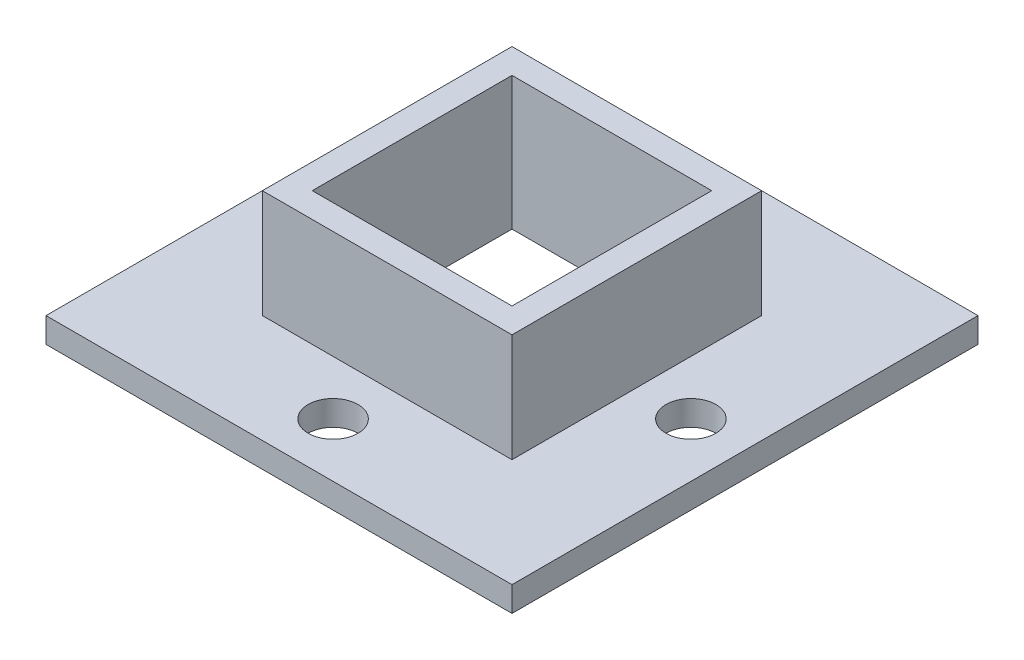
ISO-10303-21;
HEADER;
FILE_DESCRIPTION(('STEP AP214'),'2;1');
FILE_NAME('part.step','',(''),(''),'','','');
FILE_SCHEMA(('AUTOMOTIVE_DESIGN { 1 0 10303 214 1 1 1 1 }'));
ENDSEC;
DATA;
#1=APPLICATION_CONTEXT('core data for automotive mechanical design processes');
#2=APPLICATION_PROTOCOL_DEFINITION('international standard','automotive_design',2000,#1);
#3=PRODUCT_CONTEXT('',#1,'mechanical');
#4=PRODUCT('Part','Part','',(#3));
#5=PRODUCT_RELATED_PRODUCT_CATEGORY('part','',(#4));
#6=PRODUCT_DEFINITION_FORMATION('','',#4);
#7=PRODUCT_DEFINITION_CONTEXT('part definition',#1,'design');
#8=PRODUCT_DEFINITION('design','',#6,#7);
#9=PRODUCT_DEFINITION_SHAPE('','',#8);
#10=(LENGTH_UNIT() NAMED_UNIT(*) SI_UNIT(.MILLI.,.METRE.));
#11=(NAMED_UNIT(*) PLANE_ANGLE_UNIT() SI_UNIT($,.RADIAN.));
#12=(NAMED_UNIT(*) SI_UNIT($,.STERADIAN.) SOLID_ANGLE_UNIT());
#13=UNCERTAINTY_MEASURE_WITH_UNIT(LENGTH_MEASURE(1.E-05),#10,'distance_accuracy_value','');
#14=(GEOMETRIC_REPRESENTATION_CONTEXT(3) GLOBAL_UNCERTAINTY_ASSIGNED_CONTEXT((#13)) GLOBAL_UNIT_ASSIGNED_CONTEXT((#10,
#11,#12)) REPRESENTATION_CONTEXT('',''));
#15=CARTESIAN_POINT('',(0.,0.,0.));
#16=DIRECTION('',(0.,0.,1.));
#17=DIRECTION('',(1.,0.,0.));
#18=AXIS2_PLACEMENT_3D('',#15,#16,#17);
#19=CARTESIAN_POINT('',(0.,9.525,0.));
#20=DIRECTION('',(0.,-1.,0.));
#21=DIRECTION('',(0.,0.,-1.));
#22=AXIS2_PLACEMENT_3D('',#19,#20,#21);
#23=PLANE('',#22);
#24=CARTESIAN_POINT('',(0.,9.525,-68.2625));
#25=DIRECTION('',(0.,1.,0.));
#26=DIRECTION('',(0.,0.,-1.));
#27=AXIS2_PLACEMENT_3D('',#24,#25,#26);
#28=CIRCLE('',#27,9.52499999999999);
#29=CARTESIAN_POINT('',(0.,9.525,-77.7875));
#30=VERTEX_POINT('',#29);
#31=EDGE_CURVE('E232',#30,#30,#28,.T.);
#32=ORIENTED_EDGE('',*,*,#31,.F.);
#33=EDGE_LOOP('',(#32));
#34=FACE_BOUND('',#33,.T.);
#35=CARTESIAN_POINT('',(-68.2625,9.525,0.));
#36=DIRECTION('',(0.,1.,0.));
#37=DIRECTION('',(0.,0.,-1.));
#38=AXIS2_PLACEMENT_3D('',#35,#36,#37);
#39=CIRCLE('',#38,9.52500000000001);
#40=CARTESIAN_POINT('',(-68.2625,9.525,-9.525));
#41=VERTEX_POINT('',#40);
#42=EDGE_CURVE('E246',#41,#41,#39,.T.);
#43=ORIENTED_EDGE('',*,*,#42,.F.);
#44=EDGE_LOOP('',(#43));
#45=FACE_BOUND('',#44,.T.);
#46=CARTESIAN_POINT('',(68.2625,9.525,0.));
#47=DIRECTION('',(0.,1.,0.));
#48=DIRECTION('',(0.,0.,1.));
#49=AXIS2_PLACEMENT_3D('',#46,#47,#48);
#50=CIRCLE('',#49,9.525);
#51=CARTESIAN_POINT('',(68.2625,9.525,9.52500000000007));
#52=VERTEX_POINT('',#51);
#53=EDGE_CURVE('E243',#52,#52,#50,.T.);
#54=ORIENTED_EDGE('',*,*,#53,.F.);
#55=EDGE_LOOP('',(#54));
#56=FACE_BOUND('',#55,.T.);
#57=CARTESIAN_POINT('',(0.,9.525,68.2625));
#58=DIRECTION('',(0.,1.,0.));
#59=DIRECTION('',(0.,0.,1.));
#60=AXIS2_PLACEMENT_3D('',#57,#58,#59);
#61=CIRCLE('',#60,9.525);
#62=CARTESIAN_POINT('',(0.,9.525,77.7875));
#63=VERTEX_POINT('',#62);
#64=EDGE_CURVE('E228',#63,#63,#61,.T.);
#65=ORIENTED_EDGE('',*,*,#64,.F.);
#66=EDGE_LOOP('',(#65));
#67=FACE_BOUND('',#66,.T.);
#68=DIRECTION('',(0.,0.,1.));
#69=VECTOR('',#68,1.);
#70=CARTESIAN_POINT('',(-88.9,9.525,88.9));
#71=LINE('',#70,#69);
#72=CARTESIAN_POINT('',(-88.9,9.525,-88.9));
#73=VERTEX_POINT('',#72);
#74=CARTESIAN_POINT('',(-88.9,9.525,88.9));
#75=VERTEX_POINT('',#74);
#76=EDGE_CURVE('E201',#73,#75,#71,.T.);
#77=ORIENTED_EDGE('',*,*,#76,.T.);
#78=DIRECTION('',(1.,0.,0.));
#79=VECTOR('',#78,1.);
#80=CARTESIAN_POINT('',(-88.9,9.525,88.9));
#81=LINE('',#80,#79);
#82=CARTESIAN_POINT('',(88.9,9.525,88.9));
#83=VERTEX_POINT('',#82);
#84=EDGE_CURVE('E204',#75,#83,#81,.T.);
#85=ORIENTED_EDGE('',*,*,#84,.T.);
#86=DIRECTION('',(0.,0.,-1.));
#87=VECTOR('',#86,1.);
#88=CARTESIAN_POINT('',(88.9,9.525,88.9));
#89=LINE('',#88,#87);
#90=CARTESIAN_POINT('',(88.9,9.525,-88.9));
#91=VERTEX_POINT('',#90);
#92=EDGE_CURVE('E207',#83,#91,#89,.T.);
#93=ORIENTED_EDGE('',*,*,#92,.T.);
#94=DIRECTION('',(-1.,0.,0.));
#95=VECTOR('',#94,1.);
#96=CARTESIAN_POINT('',(-88.9,9.525,-88.9));
#97=LINE('',#96,#95);
#98=EDGE_CURVE('E209',#91,#73,#97,.T.);
#99=ORIENTED_EDGE('',*,*,#98,.T.);
#100=EDGE_LOOP('',(#77,#85,#93,#99));
#101=FACE_BOUND('',#100,.T.);
#102=DIRECTION('',(-1.,0.,0.));
#103=VECTOR('',#102,1.);
#104=CARTESIAN_POINT('',(-47.625,9.525,-47.625));
#105=LINE('',#104,#103);
#106=CARTESIAN_POINT('',(47.625,9.525,-47.625));
#107=VERTEX_POINT('',#106);
#108=CARTESIAN_POINT('',(-47.625,9.525,-47.625));
#109=VERTEX_POINT('',#108);
#110=EDGE_CURVE('E158',#107,#109,#105,.T.);
#111=ORIENTED_EDGE('',*,*,#110,.F.);
#112=DIRECTION('',(0.,0.,-1.));
#113=VECTOR('',#112,1.);
#114=CARTESIAN_POINT('',(47.625,9.525,-47.625));
#115=LINE('',#114,#113);
#116=CARTESIAN_POINT('',(47.625,9.525,47.625));
#117=VERTEX_POINT('',#116);
#118=EDGE_CURVE('E163',#117,#107,#115,.T.);
#119=ORIENTED_EDGE('',*,*,#118,.F.);
#120=DIRECTION('',(1.,0.,0.));
#121=VECTOR('',#120,1.);
#122=CARTESIAN_POINT('',(-47.625,9.525,47.625));
#123=LINE('',#122,#121);
#124=CARTESIAN_POINT('',(-47.625,9.525,47.625));
#125=VERTEX_POINT('',#124);
#126=EDGE_CURVE('E59',#125,#117,#123,.T.);
#127=ORIENTED_EDGE('',*,*,#126,.F.);
#128=DIRECTION('',(0.,0.,1.));
#129=VECTOR('',#128,1.);
#130=CARTESIAN_POINT('',(-47.625,9.525,-47.625));
#131=LINE('',#130,#129);
#132=EDGE_CURVE('E54',#109,#125,#131,.T.);
#133=ORIENTED_EDGE('',*,*,#132,.F.);
#134=EDGE_LOOP('',(#111,#119,#127,#133));
#135=FACE_BOUND('',#134,.T.);
#136=ADVANCED_FACE('F37',(#34,#45,#56,#67,#101,#135),#23,.F.);
#137=CARTESIAN_POINT('',(0.,0.,0.));
#138=DIRECTION('',(0.,-1.,0.));
#139=DIRECTION('',(0.,0.,-1.));
#140=AXIS2_PLACEMENT_3D('',#137,#138,#139);
#141=PLANE('',#140);
#142=CARTESIAN_POINT('',(0.,0.,-68.2625));
#143=DIRECTION('',(0.,-1.,0.));
#144=DIRECTION('',(0.,0.,-1.));
#145=AXIS2_PLACEMENT_3D('',#142,#143,#144);
#146=CIRCLE('',#145,9.52499999999999);
#147=CARTESIAN_POINT('',(0.,0.,-77.7875));
#148=VERTEX_POINT('',#147);
#149=EDGE_CURVE('E41',#148,#148,#146,.T.);
#150=ORIENTED_EDGE('',*,*,#149,.F.);
#151=EDGE_LOOP('',(#150));
#152=FACE_BOUND('',#151,.T.);
#153=CARTESIAN_POINT('',(-68.2625,0.,0.));
#154=DIRECTION('',(0.,-1.,0.));
#155=DIRECTION('',(0.,0.,-1.));
#156=AXIS2_PLACEMENT_3D('',#153,#154,#155);
#157=CIRCLE('',#156,9.52500000000001);
#158=CARTESIAN_POINT('',(-68.2625,0.,-9.525));
#159=VERTEX_POINT('',#158);
#160=EDGE_CURVE('E231',#159,#159,#157,.T.);
#161=ORIENTED_EDGE('',*,*,#160,.F.);
#162=EDGE_LOOP('',(#161));
#163=FACE_BOUND('',#162,.T.);
#164=CARTESIAN_POINT('',(68.2625,0.,0.));
#165=DIRECTION('',(0.,-1.,0.));
#166=DIRECTION('',(0.,0.,-1.));
#167=AXIS2_PLACEMENT_3D('',#164,#165,#166);
#168=CIRCLE('',#167,9.525);
#169=CARTESIAN_POINT('',(68.2625,0.,-9.52499999999994));
#170=VERTEX_POINT('',#169);
#171=EDGE_CURVE('E229',#170,#170,#168,.T.);
#172=ORIENTED_EDGE('',*,*,#171,.F.);
#173=EDGE_LOOP('',(#172));
#174=FACE_BOUND('',#173,.T.);
#175=CARTESIAN_POINT('',(0.,0.,68.2625));
#176=DIRECTION('',(0.,-1.,0.));
#177=DIRECTION('',(0.,0.,-1.));
#178=AXIS2_PLACEMENT_3D('',#175,#176,#177);
#179=CIRCLE('',#178,9.525);
#180=CARTESIAN_POINT('',(0.,0.,58.7375));
#181=VERTEX_POINT('',#180);
#182=EDGE_CURVE('E147',#181,#181,#179,.T.);
#183=ORIENTED_EDGE('',*,*,#182,.F.);
#184=EDGE_LOOP('',(#183));
#185=FACE_BOUND('',#184,.T.);
#186=DIRECTION('',(0.,0.,1.));
#187=VECTOR('',#186,1.);
#188=CARTESIAN_POINT('',(-88.9,0.,88.9));
#189=LINE('',#188,#187);
#190=CARTESIAN_POINT('',(-88.9,0.,-88.9));
#191=VERTEX_POINT('',#190);
#192=CARTESIAN_POINT('',(-88.9,0.,88.9));
#193=VERTEX_POINT('',#192);
#194=EDGE_CURVE('E200',#191,#193,#189,.T.);
#195=ORIENTED_EDGE('',*,*,#194,.F.);
#196=DIRECTION('',(-1.,0.,0.));
#197=VECTOR('',#196,1.);
#198=CARTESIAN_POINT('',(-88.9,0.,-88.9));
#199=LINE('',#198,#197);
#200=CARTESIAN_POINT('',(88.9,0.,-88.9));
#201=VERTEX_POINT('',#200);
#202=EDGE_CURVE('E205',#201,#191,#199,.T.);
#203=ORIENTED_EDGE('',*,*,#202,.F.);
#204=DIRECTION('',(0.,0.,-1.));
#205=VECTOR('',#204,1.);
#206=CARTESIAN_POINT('',(88.9,0.,88.9));
#207=LINE('',#206,#205);
#208=CARTESIAN_POINT('',(88.9,0.,88.9));
#209=VERTEX_POINT('',#208);
#210=EDGE_CURVE('E216',#209,#201,#207,.T.);
#211=ORIENTED_EDGE('',*,*,#210,.F.);
#212=DIRECTION('',(1.,0.,0.));
#213=VECTOR('',#212,1.);
#214=CARTESIAN_POINT('',(-88.9,0.,88.9));
#215=LINE('',#214,#213);
#216=EDGE_CURVE('E214',#193,#209,#215,.T.);
#217=ORIENTED_EDGE('',*,*,#216,.F.);
#218=EDGE_LOOP('',(#195,#203,#211,#217));
#219=FACE_BOUND('',#218,.T.);
#220=DIRECTION('',(1.,0.,0.));
#221=VECTOR('',#220,1.);
#222=CARTESIAN_POINT('',(-38.1,0.,38.1));
#223=LINE('',#222,#221);
#224=CARTESIAN_POINT('',(-38.1,0.,38.1));
#225=VERTEX_POINT('',#224);
#226=CARTESIAN_POINT('',(38.1,0.,38.1));
#227=VERTEX_POINT('',#226);
#228=EDGE_CURVE('E134',#225,#227,#223,.T.);
#229=ORIENTED_EDGE('',*,*,#228,.T.);
#230=DIRECTION('',(0.,0.,-1.));
#231=VECTOR('',#230,1.);
#232=CARTESIAN_POINT('',(38.1,0.,38.1));
#233=LINE('',#232,#231);
#234=CARTESIAN_POINT('',(38.1,0.,-38.1));
#235=VERTEX_POINT('',#234);
#236=EDGE_CURVE('E186',#227,#235,#233,.T.);
#237=ORIENTED_EDGE('',*,*,#236,.T.);
#238=DIRECTION('',(-1.,0.,0.));
#239=VECTOR('',#238,1.);
#240=CARTESIAN_POINT('',(-38.1,0.,-38.1));
#241=LINE('',#240,#239);
#242=CARTESIAN_POINT('',(-38.1,0.,-38.1));
#243=VERTEX_POINT('',#242);
#244=EDGE_CURVE('E189',#235,#243,#241,.T.);
#245=ORIENTED_EDGE('',*,*,#244,.T.);
#246=DIRECTION('',(0.,0.,1.));
#247=VECTOR('',#246,1.);
#248=CARTESIAN_POINT('',(-38.1,0.,38.1));
#249=LINE('',#248,#247);
#250=EDGE_CURVE('E192',#243,#225,#249,.T.);
#251=ORIENTED_EDGE('',*,*,#250,.T.);
#252=EDGE_LOOP('',(#229,#237,#245,#251));
#253=FACE_BOUND('',#252,.T.);
#254=ADVANCED_FACE('F256',(#152,#163,#174,#185,#219,#253),#141,.T.);
#255=CARTESIAN_POINT('',(-88.9,9.525,88.9));
#256=DIRECTION('',(1.,0.,0.));
#257=DIRECTION('',(0.,0.,-1.));
#258=AXIS2_PLACEMENT_3D('',#255,#256,#257);
#259=PLANE('',#258);
#260=ORIENTED_EDGE('',*,*,#194,.T.);
#261=DIRECTION('',(0.,-1.,0.));
#262=VECTOR('',#261,1.);
#263=CARTESIAN_POINT('',(-88.9,9.525,88.9));
#264=LINE('',#263,#262);
#265=EDGE_CURVE('E11',#75,#193,#264,.T.);
#266=ORIENTED_EDGE('',*,*,#265,.F.);
#267=ORIENTED_EDGE('',*,*,#76,.F.);
#268=DIRECTION('',(0.,-1.,0.));
#269=VECTOR('',#268,1.);
#270=CARTESIAN_POINT('',(-88.9,9.525,-88.9));
#271=LINE('',#270,#269);
#272=EDGE_CURVE('E211',#73,#191,#271,.T.);
#273=ORIENTED_EDGE('',*,*,#272,.T.);
#274=EDGE_LOOP('',(#260,#266,#267,#273));
#275=FACE_BOUND('',#274,.T.);
#276=ADVANCED_FACE('F39',(#275),#259,.F.);
#277=CARTESIAN_POINT('',(-88.9,9.525,88.9));
#278=DIRECTION('',(0.,0.,-1.));
#279=DIRECTION('',(-1.,0.,0.));
#280=AXIS2_PLACEMENT_3D('',#277,#278,#279);
#281=PLANE('',#280);
#282=ORIENTED_EDGE('',*,*,#216,.T.);
#283=DIRECTION('',(0.,-1.,0.));
#284=VECTOR('',#283,1.);
#285=CARTESIAN_POINT('',(88.9,9.525,88.9));
#286=LINE('',#285,#284);
#287=EDGE_CURVE('E46',#83,#209,#286,.T.);
#288=ORIENTED_EDGE('',*,*,#287,.F.);
#289=ORIENTED_EDGE('',*,*,#84,.F.);
#290=ORIENTED_EDGE('',*,*,#265,.T.);
#291=EDGE_LOOP('',(#282,#288,#289,#290));
#292=FACE_BOUND('',#291,.T.);
#293=ADVANCED_FACE('F312',(#292),#281,.F.);
#294=CARTESIAN_POINT('',(88.9,9.525,88.9));
#295=DIRECTION('',(-1.,0.,0.));
#296=DIRECTION('',(0.,0.,1.));
#297=AXIS2_PLACEMENT_3D('',#294,#295,#296);
#298=PLANE('',#297);
#299=ORIENTED_EDGE('',*,*,#210,.T.);
#300=DIRECTION('',(0.,-1.,0.));
#301=VECTOR('',#300,1.);
#302=CARTESIAN_POINT('',(88.9,9.525,-88.9));
#303=LINE('',#302,#301);
#304=EDGE_CURVE('E221',#91,#201,#303,.T.);
#305=ORIENTED_EDGE('',*,*,#304,.F.);
#306=ORIENTED_EDGE('',*,*,#92,.F.);
#307=ORIENTED_EDGE('',*,*,#287,.T.);
#308=EDGE_LOOP('',(#299,#305,#306,#307));
#309=FACE_BOUND('',#308,.T.);
#310=ADVANCED_FACE('F309',(#309),#298,.F.);
#311=CARTESIAN_POINT('',(-88.9,9.525,-88.9));
#312=DIRECTION('',(0.,0.,1.));
#313=DIRECTION('',(1.,0.,0.));
#314=AXIS2_PLACEMENT_3D('',#311,#312,#313);
#315=PLANE('',#314);
#316=ORIENTED_EDGE('',*,*,#202,.T.);
#317=ORIENTED_EDGE('',*,*,#272,.F.);
#318=ORIENTED_EDGE('',*,*,#98,.F.);
#319=ORIENTED_EDGE('',*,*,#304,.T.);
#320=EDGE_LOOP('',(#316,#317,#318,#319));
#321=FACE_BOUND('',#320,.T.);
#322=ADVANCED_FACE('F301',(#321),#315,.F.);
#323=CARTESIAN_POINT('',(38.1,9.525,38.1));
#324=DIRECTION('',(-1.,0.,0.));
#325=DIRECTION('',(0.,0.,1.));
#326=AXIS2_PLACEMENT_3D('',#323,#324,#325);
#327=PLANE('',#326);
#328=ORIENTED_EDGE('',*,*,#236,.F.);
#329=DIRECTION('',(0.,-1.,0.));
#330=VECTOR('',#329,1.);
#331=CARTESIAN_POINT('',(38.1,9.525,38.1));
#332=LINE('',#331,#330);
#333=CARTESIAN_POINT('',(38.1,50.8,38.1));
#334=VERTEX_POINT('',#333);
#335=EDGE_CURVE('E139',#334,#227,#332,.T.);
#336=ORIENTED_EDGE('',*,*,#335,.F.);
#337=DIRECTION('',(0.,0.,-1.));
#338=VECTOR('',#337,1.);
#339=CARTESIAN_POINT('',(38.1,50.8,-38.1));
#340=LINE('',#339,#338);
#341=CARTESIAN_POINT('',(38.1,50.8,-38.1));
#342=VERTEX_POINT('',#341);
#343=EDGE_CURVE('E151',#334,#342,#340,.T.);
#344=ORIENTED_EDGE('',*,*,#343,.T.);
#345=DIRECTION('',(0.,-1.,0.));
#346=VECTOR('',#345,1.);
#347=CARTESIAN_POINT('',(38.1,9.525,-38.1));
#348=LINE('',#347,#346);
#349=EDGE_CURVE('E197',#342,#235,#348,.T.);
#350=ORIENTED_EDGE('',*,*,#349,.T.);
#351=EDGE_LOOP('',(#328,#336,#344,#350));
#352=FACE_BOUND('',#351,.T.);
#353=ADVANCED_FACE('F298',(#352),#327,.T.);
#354=CARTESIAN_POINT('',(-38.1,9.525,-38.1));
#355=DIRECTION('',(0.,0.,1.));
#356=DIRECTION('',(1.,0.,0.));
#357=AXIS2_PLACEMENT_3D('',#354,#355,#356);
#358=PLANE('',#357);
#359=ORIENTED_EDGE('',*,*,#244,.F.);
#360=ORIENTED_EDGE('',*,*,#349,.F.);
#361=DIRECTION('',(-1.,0.,0.));
#362=VECTOR('',#361,1.);
#363=CARTESIAN_POINT('',(-38.1,50.8,-38.1));
#364=LINE('',#363,#362);
#365=CARTESIAN_POINT('',(-38.1,50.8,-38.1));
#366=VERTEX_POINT('',#365);
#367=EDGE_CURVE('E153',#342,#366,#364,.T.);
#368=ORIENTED_EDGE('',*,*,#367,.T.);
#369=DIRECTION('',(0.,-1.,0.));
#370=VECTOR('',#369,1.);
#371=CARTESIAN_POINT('',(-38.1,9.525,-38.1));
#372=LINE('',#371,#370);
#373=EDGE_CURVE('E138',#366,#243,#372,.T.);
#374=ORIENTED_EDGE('',*,*,#373,.T.);
#375=EDGE_LOOP('',(#359,#360,#368,#374));
#376=FACE_BOUND('',#375,.T.);
#377=ADVANCED_FACE('F295',(#376),#358,.T.);
#378=CARTESIAN_POINT('',(-38.1,9.525,38.1));
#379=DIRECTION('',(1.,0.,0.));
#380=DIRECTION('',(0.,0.,-1.));
#381=AXIS2_PLACEMENT_3D('',#378,#379,#380);
#382=PLANE('',#381);
#383=ORIENTED_EDGE('',*,*,#250,.F.);
#384=ORIENTED_EDGE('',*,*,#373,.F.);
#385=DIRECTION('',(0.,0.,1.));
#386=VECTOR('',#385,1.);
#387=CARTESIAN_POINT('',(-38.1,50.8,-38.1));
#388=LINE('',#387,#386);
#389=CARTESIAN_POINT('',(-38.1,50.8,38.1));
#390=VERTEX_POINT('',#389);
#391=EDGE_CURVE('E142',#366,#390,#388,.T.);
#392=ORIENTED_EDGE('',*,*,#391,.T.);
#393=DIRECTION('',(0.,-1.,0.));
#394=VECTOR('',#393,1.);
#395=CARTESIAN_POINT('',(-38.1,9.525,38.1));
#396=LINE('',#395,#394);
#397=EDGE_CURVE('E126',#390,#225,#396,.T.);
#398=ORIENTED_EDGE('',*,*,#397,.T.);
#399=EDGE_LOOP('',(#383,#384,#392,#398));
#400=FACE_BOUND('',#399,.T.);
#401=ADVANCED_FACE('F143',(#400),#382,.T.);
#402=CARTESIAN_POINT('',(-38.1,9.525,38.1));
#403=DIRECTION('',(0.,0.,-1.));
#404=DIRECTION('',(-1.,0.,0.));
#405=AXIS2_PLACEMENT_3D('',#402,#403,#404);
#406=PLANE('',#405);
#407=ORIENTED_EDGE('',*,*,#228,.F.);
#408=ORIENTED_EDGE('',*,*,#397,.F.);
#409=DIRECTION('',(1.,0.,0.));
#410=VECTOR('',#409,1.);
#411=CARTESIAN_POINT('',(-38.1,50.8,38.1));
#412=LINE('',#411,#410);
#413=EDGE_CURVE('E131',#390,#334,#412,.T.);
#414=ORIENTED_EDGE('',*,*,#413,.T.);
#415=ORIENTED_EDGE('',*,*,#335,.T.);
#416=EDGE_LOOP('',(#407,#408,#414,#415));
#417=FACE_BOUND('',#416,.T.);
#418=ADVANCED_FACE('F128',(#417),#406,.T.);
#419=CARTESIAN_POINT('',(0.,50.8,0.));
#420=DIRECTION('',(0.,-1.,0.));
#421=DIRECTION('',(0.,0.,-1.));
#422=AXIS2_PLACEMENT_3D('',#419,#420,#421);
#423=PLANE('',#422);
#424=DIRECTION('',(-1.,0.,0.));
#425=VECTOR('',#424,1.);
#426=CARTESIAN_POINT('',(-47.625,50.8,-47.625));
#427=LINE('',#426,#425);
#428=CARTESIAN_POINT('',(47.625,50.8,-47.625));
#429=VERTEX_POINT('',#428);
#430=CARTESIAN_POINT('',(-47.625,50.8,-47.625));
#431=VERTEX_POINT('',#430);
#432=EDGE_CURVE('E159',#429,#431,#427,.T.);
#433=ORIENTED_EDGE('',*,*,#432,.T.);
#434=DIRECTION('',(0.,0.,1.));
#435=VECTOR('',#434,1.);
#436=CARTESIAN_POINT('',(-47.625,50.8,-47.625));
#437=LINE('',#436,#435);
#438=CARTESIAN_POINT('',(-47.625,50.8,47.625));
#439=VERTEX_POINT('',#438);
#440=EDGE_CURVE('E162',#431,#439,#437,.T.);
#441=ORIENTED_EDGE('',*,*,#440,.T.);
#442=DIRECTION('',(1.,0.,0.));
#443=VECTOR('',#442,1.);
#444=CARTESIAN_POINT('',(-47.625,50.8,47.625));
#445=LINE('',#444,#443);
#446=CARTESIAN_POINT('',(47.625,50.8,47.625));
#447=VERTEX_POINT('',#446);
#448=EDGE_CURVE('E165',#439,#447,#445,.T.);
#449=ORIENTED_EDGE('',*,*,#448,.T.);
#450=DIRECTION('',(0.,0.,-1.));
#451=VECTOR('',#450,1.);
#452=CARTESIAN_POINT('',(47.625,50.8,-47.625));
#453=LINE('',#452,#451);
#454=EDGE_CURVE('E167',#447,#429,#453,.T.);
#455=ORIENTED_EDGE('',*,*,#454,.T.);
#456=EDGE_LOOP('',(#433,#441,#449,#455));
#457=FACE_BOUND('',#456,.T.);
#458=ORIENTED_EDGE('',*,*,#391,.F.);
#459=ORIENTED_EDGE('',*,*,#367,.F.);
#460=ORIENTED_EDGE('',*,*,#343,.F.);
#461=ORIENTED_EDGE('',*,*,#413,.F.);
#462=EDGE_LOOP('',(#458,#459,#460,#461));
#463=FACE_BOUND('',#462,.T.);
#464=ADVANCED_FACE('F149',(#457,#463),#423,.F.);
#465=CARTESIAN_POINT('',(-47.625,50.8,-47.625));
#466=DIRECTION('',(0.,0.,1.));
#467=DIRECTION('',(1.,0.,0.));
#468=AXIS2_PLACEMENT_3D('',#465,#466,#467);
#469=PLANE('',#468);
#470=ORIENTED_EDGE('',*,*,#110,.T.);
#471=DIRECTION('',(0.,-1.,0.));
#472=VECTOR('',#471,1.);
#473=CARTESIAN_POINT('',(-47.625,50.8,-47.625));
#474=LINE('',#473,#472);
#475=EDGE_CURVE('E184',#431,#109,#474,.T.);
#476=ORIENTED_EDGE('',*,*,#475,.F.);
#477=ORIENTED_EDGE('',*,*,#432,.F.);
#478=DIRECTION('',(0.,-1.,0.));
#479=VECTOR('',#478,1.);
#480=CARTESIAN_POINT('',(47.625,50.8,-47.625));
#481=LINE('',#480,#479);
#482=EDGE_CURVE('E169',#429,#107,#481,.T.);
#483=ORIENTED_EDGE('',*,*,#482,.T.);
#484=EDGE_LOOP('',(#470,#476,#477,#483));
#485=FACE_BOUND('',#484,.T.);
#486=ADVANCED_FACE('F273',(#485),#469,.F.);
#487=CARTESIAN_POINT('',(-47.625,50.8,-47.625));
#488=DIRECTION('',(1.,0.,0.));
#489=DIRECTION('',(0.,0.,-1.));
#490=AXIS2_PLACEMENT_3D('',#487,#488,#489);
#491=PLANE('',#490);
#492=ORIENTED_EDGE('',*,*,#132,.T.);
#493=DIRECTION('',(0.,-1.,0.));
#494=VECTOR('',#493,1.);
#495=CARTESIAN_POINT('',(-47.625,50.8,47.625));
#496=LINE('',#495,#494);
#497=EDGE_CURVE('E181',#439,#125,#496,.T.);
#498=ORIENTED_EDGE('',*,*,#497,.F.);
#499=ORIENTED_EDGE('',*,*,#440,.F.);
#500=ORIENTED_EDGE('',*,*,#475,.T.);
#501=EDGE_LOOP('',(#492,#498,#499,#500));
#502=FACE_BOUND('',#501,.T.);
#503=ADVANCED_FACE('F280',(#502),#491,.F.);
#504=CARTESIAN_POINT('',(-47.625,50.8,47.625));
#505=DIRECTION('',(0.,0.,-1.));
#506=DIRECTION('',(-1.,0.,0.));
#507=AXIS2_PLACEMENT_3D('',#504,#505,#506);
#508=PLANE('',#507);
#509=ORIENTED_EDGE('',*,*,#126,.T.);
#510=DIRECTION('',(0.,-1.,0.));
#511=VECTOR('',#510,1.);
#512=CARTESIAN_POINT('',(47.625,50.8,47.625));
#513=LINE('',#512,#511);
#514=EDGE_CURVE('E178',#447,#117,#513,.T.);
#515=ORIENTED_EDGE('',*,*,#514,.F.);
#516=ORIENTED_EDGE('',*,*,#448,.F.);
#517=ORIENTED_EDGE('',*,*,#497,.T.);
#518=EDGE_LOOP('',(#509,#515,#516,#517));
#519=FACE_BOUND('',#518,.T.);
#520=ADVANCED_FACE('F278',(#519),#508,.F.);
#521=CARTESIAN_POINT('',(47.625,50.8,-47.625));
#522=DIRECTION('',(-1.,0.,0.));
#523=DIRECTION('',(0.,0.,1.));
#524=AXIS2_PLACEMENT_3D('',#521,#522,#523);
#525=PLANE('',#524);
#526=ORIENTED_EDGE('',*,*,#118,.T.);
#527=ORIENTED_EDGE('',*,*,#482,.F.);
#528=ORIENTED_EDGE('',*,*,#454,.F.);
#529=ORIENTED_EDGE('',*,*,#514,.T.);
#530=EDGE_LOOP('',(#526,#527,#528,#529));
#531=FACE_BOUND('',#530,.T.);
#532=ADVANCED_FACE('F269',(#531),#525,.F.);
#533=CARTESIAN_POINT('',(0.,-2.475,68.2625));
#534=DIRECTION('',(0.,1.,0.));
#535=DIRECTION('',(0.,0.,1.));
#536=AXIS2_PLACEMENT_3D('',#533,#534,#535);
#537=CYLINDRICAL_SURFACE('',#536,9.525);
#538=ORIENTED_EDGE('',*,*,#182,.T.);
#539=EDGE_LOOP('',(#538));
#540=FACE_BOUND('',#539,.T.);
#541=ORIENTED_EDGE('',*,*,#64,.T.);
#542=EDGE_LOOP('',(#541));
#543=FACE_BOUND('',#542,.T.);
#544=ADVANCED_FACE('F352',(#540,#543),#537,.F.);
#545=CARTESIAN_POINT('',(68.2625,-2.475,0.));
#546=DIRECTION('',(0.,1.,0.));
#547=DIRECTION('',(0.,0.,1.));
#548=AXIS2_PLACEMENT_3D('',#545,#546,#547);
#549=CYLINDRICAL_SURFACE('',#548,9.525);
#550=ORIENTED_EDGE('',*,*,#171,.T.);
#551=EDGE_LOOP('',(#550));
#552=FACE_BOUND('',#551,.T.);
#553=ORIENTED_EDGE('',*,*,#53,.T.);
#554=EDGE_LOOP('',(#553));
#555=FACE_BOUND('',#554,.T.);
#556=ADVANCED_FACE('F437',(#552,#555),#549,.F.);
#557=CARTESIAN_POINT('',(-68.2625,-2.475,0.));
#558=DIRECTION('',(0.,1.,0.));
#559=DIRECTION('',(0.,0.,1.));
#560=AXIS2_PLACEMENT_3D('',#557,#558,#559);
#561=CYLINDRICAL_SURFACE('',#560,9.52500000000001);
#562=ORIENTED_EDGE('',*,*,#160,.T.);
#563=EDGE_LOOP('',(#562));
#564=FACE_BOUND('',#563,.T.);
#565=ORIENTED_EDGE('',*,*,#42,.T.);
#566=EDGE_LOOP('',(#565));
#567=FACE_BOUND('',#566,.T.);
#568=ADVANCED_FACE('F441',(#564,#567),#561,.F.);
#569=CARTESIAN_POINT('',(0.,-2.475,-68.2625));
#570=DIRECTION('',(0.,1.,0.));
#571=DIRECTION('',(0.,0.,1.));
#572=AXIS2_PLACEMENT_3D('',#569,#570,#571);
#573=CYLINDRICAL_SURFACE('',#572,9.52499999999999);
#574=ORIENTED_EDGE('',*,*,#149,.T.);
#575=EDGE_LOOP('',(#574));
#576=FACE_BOUND('',#575,.T.);
#577=ORIENTED_EDGE('',*,*,#31,.T.);
#578=EDGE_LOOP('',(#577));
#579=FACE_BOUND('',#578,.T.);
#580=ADVANCED_FACE('F252',(#576,#579),#573,.F.);
#581=CLOSED_SHELL('',(#136,#254,#276,#293,#310,#322,#353,#377,#401,#418,#464,#486,#503,#520,
#532,#544,#556,#568,#580));
#582=MANIFOLD_SOLID_BREP('B2',#581);
#583=ADVANCED_BREP_SHAPE_REPRESENTATION('',(#18,#582),#14);
#584=SHAPE_DEFINITION_REPRESENTATION(#9,#583);
ENDSEC;
END-ISO-10303-21;
